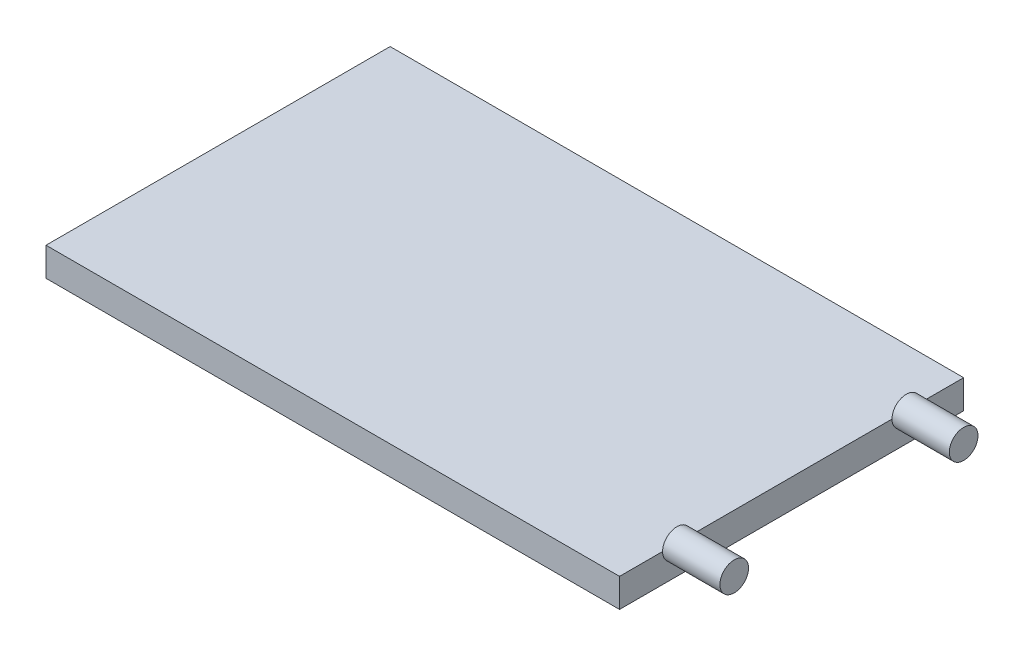
ISO-10303-21;
HEADER;
FILE_DESCRIPTION(('STEP AP214'),'2;1');
FILE_NAME('part.step','',(''),(''),'','','');
FILE_SCHEMA(('AUTOMOTIVE_DESIGN { 1 0 10303 214 1 1 1 1 }'));
ENDSEC;
DATA;
#1=APPLICATION_CONTEXT('core data for automotive mechanical design processes');
#2=APPLICATION_PROTOCOL_DEFINITION('international standard','automotive_design',2000,#1);
#3=PRODUCT_CONTEXT('',#1,'mechanical');
#4=PRODUCT('Part','Part','',(#3));
#5=PRODUCT_RELATED_PRODUCT_CATEGORY('part','',(#4));
#6=PRODUCT_DEFINITION_FORMATION('','',#4);
#7=PRODUCT_DEFINITION_CONTEXT('part definition',#1,'design');
#8=PRODUCT_DEFINITION('design','',#6,#7);
#9=PRODUCT_DEFINITION_SHAPE('','',#8);
#10=(LENGTH_UNIT() NAMED_UNIT(*) SI_UNIT(.MILLI.,.METRE.));
#11=(NAMED_UNIT(*) PLANE_ANGLE_UNIT() SI_UNIT($,.RADIAN.));
#12=(NAMED_UNIT(*) SI_UNIT($,.STERADIAN.) SOLID_ANGLE_UNIT());
#13=UNCERTAINTY_MEASURE_WITH_UNIT(LENGTH_MEASURE(1.E-05),#10,'distance_accuracy_value','');
#14=(GEOMETRIC_REPRESENTATION_CONTEXT(3) GLOBAL_UNCERTAINTY_ASSIGNED_CONTEXT((#13)) GLOBAL_UNIT_ASSIGNED_CONTEXT((#10,
#11,#12)) REPRESENTATION_CONTEXT('',''));
#15=CARTESIAN_POINT('',(0.,0.,0.));
#16=DIRECTION('',(0.,0.,1.));
#17=DIRECTION('',(1.,0.,0.));
#18=AXIS2_PLACEMENT_3D('',#15,#16,#17);
#19=CARTESIAN_POINT('',(5.,0.5,-3.));
#20=DIRECTION('',(-1.,0.,0.));
#21=DIRECTION('',(0.,0.,1.));
#22=AXIS2_PLACEMENT_3D('',#19,#20,#21);
#23=PLANE('',#22);
#24=CARTESIAN_POINT('',(5.,0.5,-2.));
#25=DIRECTION('',(1.,0.,0.));
#26=DIRECTION('',(0.,0.,-1.));
#27=AXIS2_PLACEMENT_3D('',#24,#25,#26);
#28=CIRCLE('',#27,0.25);
#29=CARTESIAN_POINT('',(5.,0.5,-1.75));
#30=VERTEX_POINT('',#29);
#31=CARTESIAN_POINT('',(5.,0.5,-2.25));
#32=VERTEX_POINT('',#31);
#33=EDGE_CURVE('E94',#30,#32,#28,.T.);
#34=ORIENTED_EDGE('',*,*,#33,.F.);
#35=DIRECTION('',(0.,0.,-1.));
#36=VECTOR('',#35,1.);
#37=CARTESIAN_POINT('',(5.,0.5,-3.));
#38=LINE('',#37,#36);
#39=CARTESIAN_POINT('',(5.,0.5,1.75));
#40=VERTEX_POINT('',#39);
#41=EDGE_CURVE('E88',#40,#30,#38,.T.);
#42=ORIENTED_EDGE('',*,*,#41,.F.);
#43=CARTESIAN_POINT('',(5.,0.5,2.));
#44=DIRECTION('',(1.,0.,0.));
#45=DIRECTION('',(0.,0.,-1.));
#46=AXIS2_PLACEMENT_3D('',#43,#44,#45);
#47=CIRCLE('',#46,0.25);
#48=CARTESIAN_POINT('',(5.,0.5,2.25));
#49=VERTEX_POINT('',#48);
#50=EDGE_CURVE('E11',#49,#40,#47,.T.);
#51=ORIENTED_EDGE('',*,*,#50,.F.);
#52=CARTESIAN_POINT('',(5.,0.5,3.));
#53=VERTEX_POINT('',#52);
#54=EDGE_CURVE('E102',#53,#49,#38,.T.);
#55=ORIENTED_EDGE('',*,*,#54,.F.);
#56=DIRECTION('',(0.,-1.,0.));
#57=VECTOR('',#56,1.);
#58=CARTESIAN_POINT('',(5.,0.5,3.));
#59=LINE('',#58,#57);
#60=CARTESIAN_POINT('',(5.,0.,3.));
#61=VERTEX_POINT('',#60);
#62=EDGE_CURVE('E111',#53,#61,#59,.T.);
#63=ORIENTED_EDGE('',*,*,#62,.T.);
#64=DIRECTION('',(0.,0.,-1.));
#65=VECTOR('',#64,1.);
#66=CARTESIAN_POINT('',(5.,0.,-3.));
#67=LINE('',#66,#65);
#68=CARTESIAN_POINT('',(5.,0.,-3.));
#69=VERTEX_POINT('',#68);
#70=EDGE_CURVE('E112',#61,#69,#67,.T.);
#71=ORIENTED_EDGE('',*,*,#70,.T.);
#72=DIRECTION('',(0.,-1.,0.));
#73=VECTOR('',#72,1.);
#74=CARTESIAN_POINT('',(5.,0.5,-3.));
#75=LINE('',#74,#73);
#76=CARTESIAN_POINT('',(5.,0.5,-3.));
#77=VERTEX_POINT('',#76);
#78=EDGE_CURVE('E35',#77,#69,#75,.T.);
#79=ORIENTED_EDGE('',*,*,#78,.F.);
#80=EDGE_CURVE('E89',#32,#77,#38,.T.);
#81=ORIENTED_EDGE('',*,*,#80,.F.);
#82=EDGE_LOOP('',(#34,#42,#51,#55,#63,#71,#79,#81));
#83=FACE_BOUND('',#82,.T.);
#84=ADVANCED_FACE('F32',(#83),#23,.F.);
#85=CARTESIAN_POINT('',(-5.,0.5,-3.));
#86=DIRECTION('',(0.,0.,1.));
#87=DIRECTION('',(1.,0.,0.));
#88=AXIS2_PLACEMENT_3D('',#85,#86,#87);
#89=PLANE('',#88);
#90=DIRECTION('',(-1.,0.,0.));
#91=VECTOR('',#90,1.);
#92=CARTESIAN_POINT('',(-5.,0.,-3.));
#93=LINE('',#92,#91);
#94=CARTESIAN_POINT('',(-5.,0.,-3.));
#95=VERTEX_POINT('',#94);
#96=EDGE_CURVE('E115',#69,#95,#93,.T.);
#97=ORIENTED_EDGE('',*,*,#96,.T.);
#98=DIRECTION('',(0.,-1.,0.));
#99=VECTOR('',#98,1.);
#100=CARTESIAN_POINT('',(-5.,0.5,-3.));
#101=LINE('',#100,#99);
#102=CARTESIAN_POINT('',(-5.,0.5,-3.));
#103=VERTEX_POINT('',#102);
#104=EDGE_CURVE('E126',#103,#95,#101,.T.);
#105=ORIENTED_EDGE('',*,*,#104,.F.);
#106=DIRECTION('',(-1.,0.,0.));
#107=VECTOR('',#106,1.);
#108=CARTESIAN_POINT('',(-5.,0.5,-3.));
#109=LINE('',#108,#107);
#110=EDGE_CURVE('E104',#77,#103,#109,.T.);
#111=ORIENTED_EDGE('',*,*,#110,.F.);
#112=ORIENTED_EDGE('',*,*,#78,.T.);
#113=EDGE_LOOP('',(#97,#105,#111,#112));
#114=FACE_BOUND('',#113,.T.);
#115=ADVANCED_FACE('F135',(#114),#89,.F.);
#116=CARTESIAN_POINT('',(-5.,0.5,-3.));
#117=DIRECTION('',(1.,0.,0.));
#118=DIRECTION('',(0.,0.,-1.));
#119=AXIS2_PLACEMENT_3D('',#116,#117,#118);
#120=PLANE('',#119);
#121=DIRECTION('',(0.,0.,1.));
#122=VECTOR('',#121,1.);
#123=CARTESIAN_POINT('',(-5.,0.,-3.));
#124=LINE('',#123,#122);
#125=CARTESIAN_POINT('',(-5.,0.,3.));
#126=VERTEX_POINT('',#125);
#127=EDGE_CURVE('E118',#95,#126,#124,.T.);
#128=ORIENTED_EDGE('',*,*,#127,.T.);
#129=DIRECTION('',(0.,-1.,0.));
#130=VECTOR('',#129,1.);
#131=CARTESIAN_POINT('',(-5.,0.5,3.));
#132=LINE('',#131,#130);
#133=CARTESIAN_POINT('',(-5.,0.5,3.));
#134=VERTEX_POINT('',#133);
#135=EDGE_CURVE('E124',#134,#126,#132,.T.);
#136=ORIENTED_EDGE('',*,*,#135,.F.);
#137=DIRECTION('',(0.,0.,1.));
#138=VECTOR('',#137,1.);
#139=CARTESIAN_POINT('',(-5.,0.5,-3.));
#140=LINE('',#139,#138);
#141=EDGE_CURVE('E107',#103,#134,#140,.T.);
#142=ORIENTED_EDGE('',*,*,#141,.F.);
#143=ORIENTED_EDGE('',*,*,#104,.T.);
#144=EDGE_LOOP('',(#128,#136,#142,#143));
#145=FACE_BOUND('',#144,.T.);
#146=ADVANCED_FACE('F142',(#145),#120,.F.);
#147=CARTESIAN_POINT('',(-5.,0.5,3.));
#148=DIRECTION('',(0.,0.,-1.));
#149=DIRECTION('',(-1.,0.,0.));
#150=AXIS2_PLACEMENT_3D('',#147,#148,#149);
#151=PLANE('',#150);
#152=DIRECTION('',(1.,0.,0.));
#153=VECTOR('',#152,1.);
#154=CARTESIAN_POINT('',(-5.,0.,3.));
#155=LINE('',#154,#153);
#156=EDGE_CURVE('E120',#126,#61,#155,.T.);
#157=ORIENTED_EDGE('',*,*,#156,.T.);
#158=ORIENTED_EDGE('',*,*,#62,.F.);
#159=DIRECTION('',(1.,0.,0.));
#160=VECTOR('',#159,1.);
#161=CARTESIAN_POINT('',(-5.,0.5,3.));
#162=LINE('',#161,#160);
#163=EDGE_CURVE('E109',#134,#53,#162,.T.);
#164=ORIENTED_EDGE('',*,*,#163,.F.);
#165=ORIENTED_EDGE('',*,*,#135,.T.);
#166=EDGE_LOOP('',(#157,#158,#164,#165));
#167=FACE_BOUND('',#166,.T.);
#168=ADVANCED_FACE('F145',(#167),#151,.F.);
#169=CARTESIAN_POINT('',(0.,0.5,0.));
#170=DIRECTION('',(0.,1.,0.));
#171=DIRECTION('',(0.,0.,1.));
#172=AXIS2_PLACEMENT_3D('',#169,#170,#171);
#173=PLANE('',#172);
#174=ORIENTED_EDGE('',*,*,#54,.T.);
#175=EDGE_CURVE('E101',#49,#40,#38,.T.);
#176=ORIENTED_EDGE('',*,*,#175,.T.);
#177=ORIENTED_EDGE('',*,*,#41,.T.);
#178=EDGE_CURVE('E84',#30,#32,#38,.T.);
#179=ORIENTED_EDGE('',*,*,#178,.T.);
#180=ORIENTED_EDGE('',*,*,#80,.T.);
#181=ORIENTED_EDGE('',*,*,#110,.T.);
#182=ORIENTED_EDGE('',*,*,#141,.T.);
#183=ORIENTED_EDGE('',*,*,#163,.T.);
#184=EDGE_LOOP('',(#174,#176,#177,#179,#180,#181,#182,#183));
#185=FACE_BOUND('',#184,.T.);
#186=ADVANCED_FACE('F99',(#185),#173,.T.);
#187=CARTESIAN_POINT('',(0.,0.,0.));
#188=DIRECTION('',(0.,1.,0.));
#189=DIRECTION('',(0.,0.,1.));
#190=AXIS2_PLACEMENT_3D('',#187,#188,#189);
#191=PLANE('',#190);
#192=ORIENTED_EDGE('',*,*,#70,.F.);
#193=ORIENTED_EDGE('',*,*,#156,.F.);
#194=ORIENTED_EDGE('',*,*,#127,.F.);
#195=ORIENTED_EDGE('',*,*,#96,.F.);
#196=EDGE_LOOP('',(#192,#193,#194,#195));
#197=FACE_BOUND('',#196,.T.);
#198=ADVANCED_FACE('F140',(#197),#191,.F.);
#199=CARTESIAN_POINT('',(6.,0.5,2.));
#200=DIRECTION('',(-1.,0.,0.));
#201=DIRECTION('',(0.,0.,1.));
#202=AXIS2_PLACEMENT_3D('',#199,#200,#201);
#203=CYLINDRICAL_SURFACE('',#202,0.25);
#204=CARTESIAN_POINT('',(6.,0.5,2.));
#205=DIRECTION('',(1.,0.,0.));
#206=DIRECTION('',(0.,0.,-1.));
#207=AXIS2_PLACEMENT_3D('',#204,#205,#206);
#208=CIRCLE('',#207,0.25);
#209=CARTESIAN_POINT('',(6.,0.5,1.75));
#210=VERTEX_POINT('',#209);
#211=EDGE_CURVE('E116',#210,#210,#208,.T.);
#212=ORIENTED_EDGE('',*,*,#211,.F.);
#213=EDGE_LOOP('',(#212));
#214=FACE_BOUND('',#213,.T.);
#215=EDGE_CURVE('E41',#40,#49,#47,.T.);
#216=ORIENTED_EDGE('',*,*,#215,.T.);
#217=ORIENTED_EDGE('',*,*,#50,.T.);
#218=EDGE_LOOP('',(#216,#217));
#219=FACE_BOUND('',#218,.T.);
#220=ADVANCED_FACE('F151',(#214,#219),#203,.T.);
#221=CARTESIAN_POINT('',(6.,0.5,2.));
#222=DIRECTION('',(1.,0.,0.));
#223=DIRECTION('',(0.,0.,-1.));
#224=AXIS2_PLACEMENT_3D('',#221,#222,#223);
#225=PLANE('',#224);
#226=ORIENTED_EDGE('',*,*,#211,.T.);
#227=EDGE_LOOP('',(#226));
#228=FACE_BOUND('',#227,.T.);
#229=ADVANCED_FACE('F166',(#228),#225,.T.);
#230=CARTESIAN_POINT('',(5.,0.5,2.));
#231=DIRECTION('',(1.,0.,0.));
#232=DIRECTION('',(0.,0.,-1.));
#233=AXIS2_PLACEMENT_3D('',#230,#231,#232);
#234=PLANE('',#233);
#235=ORIENTED_EDGE('',*,*,#175,.F.);
#236=ORIENTED_EDGE('',*,*,#215,.F.);
#237=EDGE_LOOP('',(#235,#236));
#238=FACE_BOUND('',#237,.T.);
#239=ADVANCED_FACE('F149',(#238),#234,.F.);
#240=CARTESIAN_POINT('',(6.,0.5,-2.));
#241=DIRECTION('',(-1.,0.,0.));
#242=DIRECTION('',(0.,0.,1.));
#243=AXIS2_PLACEMENT_3D('',#240,#241,#242);
#244=CYLINDRICAL_SURFACE('',#243,0.25);
#245=CARTESIAN_POINT('',(6.,0.5,-2.));
#246=DIRECTION('',(1.,0.,0.));
#247=DIRECTION('',(0.,0.,-1.));
#248=AXIS2_PLACEMENT_3D('',#245,#246,#247);
#249=CIRCLE('',#248,0.25);
#250=CARTESIAN_POINT('',(6.,0.5,-2.25));
#251=VERTEX_POINT('',#250);
#252=EDGE_CURVE('E96',#251,#251,#249,.T.);
#253=ORIENTED_EDGE('',*,*,#252,.F.);
#254=EDGE_LOOP('',(#253));
#255=FACE_BOUND('',#254,.T.);
#256=EDGE_CURVE('E47',#32,#30,#28,.T.);
#257=ORIENTED_EDGE('',*,*,#256,.T.);
#258=ORIENTED_EDGE('',*,*,#33,.T.);
#259=EDGE_LOOP('',(#257,#258));
#260=FACE_BOUND('',#259,.T.);
#261=ADVANCED_FACE('F93',(#255,#260),#244,.T.);
#262=CARTESIAN_POINT('',(6.,0.5,-2.));
#263=DIRECTION('',(1.,0.,0.));
#264=DIRECTION('',(0.,0.,-1.));
#265=AXIS2_PLACEMENT_3D('',#262,#263,#264);
#266=PLANE('',#265);
#267=ORIENTED_EDGE('',*,*,#252,.T.);
#268=EDGE_LOOP('',(#267));
#269=FACE_BOUND('',#268,.T.);
#270=ADVANCED_FACE('F157',(#269),#266,.T.);
#271=CARTESIAN_POINT('',(5.,0.5,-2.));
#272=DIRECTION('',(1.,0.,0.));
#273=DIRECTION('',(0.,0.,-1.));
#274=AXIS2_PLACEMENT_3D('',#271,#272,#273);
#275=PLANE('',#274);
#276=ORIENTED_EDGE('',*,*,#178,.F.);
#277=ORIENTED_EDGE('',*,*,#256,.F.);
#278=EDGE_LOOP('',(#276,#277));
#279=FACE_BOUND('',#278,.T.);
#280=ADVANCED_FACE('F85',(#279),#275,.F.);
#281=CLOSED_SHELL('',(#84,#115,#146,#168,#186,#198,#220,#229,#239,#261,#270,#280));
#282=MANIFOLD_SOLID_BREP('B2',#281);
#283=ADVANCED_BREP_SHAPE_REPRESENTATION('',(#18,#282),#14);
#284=SHAPE_DEFINITION_REPRESENTATION(#9,#283);
ENDSEC;
END-ISO-10303-21;
